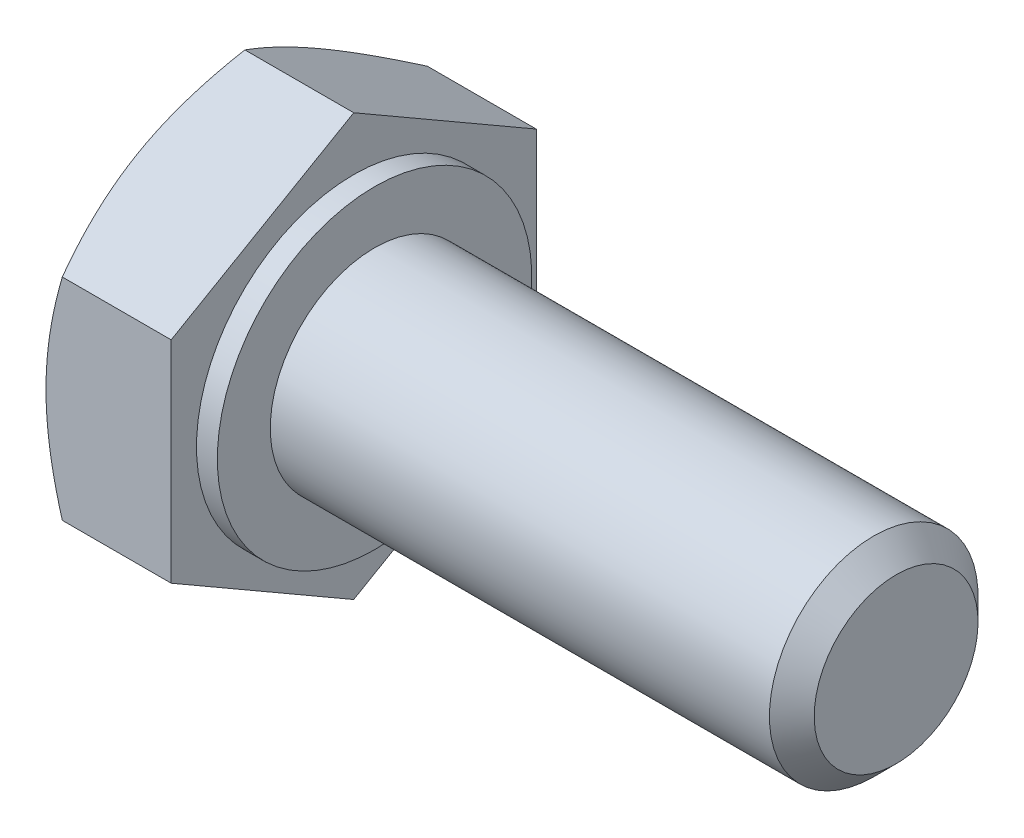
ISO-10303-21;
HEADER;
FILE_DESCRIPTION(('STEP AP214'),'2;1');
FILE_NAME('part.step','',(''),(''),'','','');
FILE_SCHEMA(('AUTOMOTIVE_DESIGN { 1 0 10303 214 1 1 1 1 }'));
ENDSEC;
DATA;
#1=APPLICATION_CONTEXT('core data for automotive mechanical design processes');
#2=APPLICATION_PROTOCOL_DEFINITION('international standard','automotive_design',2000,#1);
#3=PRODUCT_CONTEXT('',#1,'mechanical');
#4=PRODUCT('Part','Part','',(#3));
#5=PRODUCT_RELATED_PRODUCT_CATEGORY('part','',(#4));
#6=PRODUCT_DEFINITION_FORMATION('','',#4);
#7=PRODUCT_DEFINITION_CONTEXT('part definition',#1,'design');
#8=PRODUCT_DEFINITION('design','',#6,#7);
#9=PRODUCT_DEFINITION_SHAPE('','',#8);
#10=(LENGTH_UNIT() NAMED_UNIT(*) SI_UNIT(.MILLI.,.METRE.));
#11=(NAMED_UNIT(*) PLANE_ANGLE_UNIT() SI_UNIT($,.RADIAN.));
#12=(NAMED_UNIT(*) SI_UNIT($,.STERADIAN.) SOLID_ANGLE_UNIT());
#13=UNCERTAINTY_MEASURE_WITH_UNIT(LENGTH_MEASURE(1.E-05),#10,'distance_accuracy_value','');
#14=(GEOMETRIC_REPRESENTATION_CONTEXT(3) GLOBAL_UNCERTAINTY_ASSIGNED_CONTEXT((#13)) GLOBAL_UNIT_ASSIGNED_CONTEXT((#10,
#11,#12)) REPRESENTATION_CONTEXT('',''));
#15=CARTESIAN_POINT('',(0.,0.,0.));
#16=DIRECTION('',(0.,0.,1.));
#17=DIRECTION('',(1.,0.,0.));
#18=AXIS2_PLACEMENT_3D('',#15,#16,#17);
#19=CARTESIAN_POINT('',(0.,2.5075,0.));
#20=DIRECTION('',(1.,0.,0.));
#21=DIRECTION('',(0.,1.,0.));
#22=AXIS2_PLACEMENT_3D('',#19,#20,#21);
#23=PLANE('',#22);
#24=CARTESIAN_POINT('',(0.,0.,0.));
#25=DIRECTION('',(1.,0.,0.));
#26=DIRECTION('',(0.,1.,0.));
#27=AXIS2_PLACEMENT_3D('',#24,#25,#26);
#28=CIRCLE('',#27,2.);
#29=CARTESIAN_POINT('',(0.,-2.,0.));
#30=VERTEX_POINT('',#29);
#31=EDGE_CURVE('E145',#30,#30,#28,.T.);
#32=ORIENTED_EDGE('',*,*,#31,.F.);
#33=EDGE_LOOP('',(#32));
#34=FACE_BOUND('',#33,.T.);
#35=CARTESIAN_POINT('',(0.,0.,0.));
#36=DIRECTION('',(1.,0.,0.));
#37=DIRECTION('',(0.,1.,0.));
#38=AXIS2_PLACEMENT_3D('',#35,#36,#37);
#39=CIRCLE('',#38,3.015);
#40=CARTESIAN_POINT('',(0.,-3.015,0.));
#41=VERTEX_POINT('',#40);
#42=EDGE_CURVE('E30',#41,#41,#39,.T.);
#43=ORIENTED_EDGE('',*,*,#42,.T.);
#44=EDGE_LOOP('',(#43));
#45=FACE_BOUND('',#44,.T.);
#46=ADVANCED_FACE('F17',(#34,#45),#23,.T.);
#47=CARTESIAN_POINT('',(-0.200049999999994,0.,0.));
#48=DIRECTION('',(1.,0.,0.));
#49=DIRECTION('',(0.,1.,0.));
#50=AXIS2_PLACEMENT_3D('',#47,#48,#49);
#51=CYLINDRICAL_SURFACE('',#50,3.015);
#52=ORIENTED_EDGE('',*,*,#42,.F.);
#53=DIRECTION('',(-1.,0.,0.));
#54=VECTOR('',#53,1.);
#55=CARTESIAN_POINT('',(-0.200049999999994,-3.015,0.));
#56=LINE('',#55,#54);
#57=CARTESIAN_POINT('',(-0.400099999999995,-3.015,0.));
#58=VERTEX_POINT('',#57);
#59=EDGE_CURVE('E11',#41,#58,#56,.T.);
#60=ORIENTED_EDGE('',*,*,#59,.T.);
#61=CARTESIAN_POINT('',(-0.400099999999994,0.,0.));
#62=DIRECTION('',(1.,0.,0.));
#63=DIRECTION('',(0.,1.,0.));
#64=AXIS2_PLACEMENT_3D('',#61,#62,#63);
#65=CIRCLE('',#64,3.015);
#66=EDGE_CURVE('E171',#58,#58,#65,.T.);
#67=ORIENTED_EDGE('',*,*,#66,.T.);
#68=ORIENTED_EDGE('',*,*,#59,.F.);
#69=EDGE_LOOP('',(#52,#60,#67,#68));
#70=FACE_BOUND('',#69,.T.);
#71=ADVANCED_FACE('F19',(#70),#51,.T.);
#72=CARTESIAN_POINT('',(-2.8001,0.,0.));
#73=DIRECTION('',(1.,0.,0.));
#74=DIRECTION('',(0.,1.,0.));
#75=AXIS2_PLACEMENT_3D('',#72,#73,#74);
#76=PLANE('',#75);
#77=CARTESIAN_POINT('',(-2.8001,0.,0.));
#78=DIRECTION('',(-1.,0.,0.));
#79=DIRECTION('',(0.,1.,0.));
#80=AXIS2_PLACEMENT_3D('',#77,#78,#79);
#81=CIRCLE('',#80,3.5);
#82=CARTESIAN_POINT('',(-2.8001,0.,3.5));
#83=VERTEX_POINT('',#82);
#84=CARTESIAN_POINT('',(-2.8001,3.03108891324553,1.75));
#85=VERTEX_POINT('',#84);
#86=EDGE_CURVE('E160',#83,#85,#81,.T.);
#87=ORIENTED_EDGE('',*,*,#86,.T.);
#88=CARTESIAN_POINT('',(-2.8001,0.,0.));
#89=DIRECTION('',(-1.,0.,0.));
#90=DIRECTION('',(0.,1.,0.));
#91=AXIS2_PLACEMENT_3D('',#88,#89,#90);
#92=CIRCLE('',#91,3.5);
#93=CARTESIAN_POINT('',(-2.8001,3.03108891324553,-1.75));
#94=VERTEX_POINT('',#93);
#95=EDGE_CURVE('E205',#85,#94,#92,.T.);
#96=ORIENTED_EDGE('',*,*,#95,.T.);
#97=CARTESIAN_POINT('',(-2.8001,0.,0.));
#98=DIRECTION('',(-1.,0.,0.));
#99=DIRECTION('',(0.,1.,0.));
#100=AXIS2_PLACEMENT_3D('',#97,#98,#99);
#101=CIRCLE('',#100,3.5);
#102=CARTESIAN_POINT('',(-2.8001,0.,-3.5));
#103=VERTEX_POINT('',#102);
#104=EDGE_CURVE('E172',#94,#103,#101,.T.);
#105=ORIENTED_EDGE('',*,*,#104,.T.);
#106=CARTESIAN_POINT('',(-2.8001,0.,0.));
#107=DIRECTION('',(-1.,0.,0.));
#108=DIRECTION('',(0.,1.,0.));
#109=AXIS2_PLACEMENT_3D('',#106,#107,#108);
#110=CIRCLE('',#109,3.5);
#111=CARTESIAN_POINT('',(-2.8001,-3.03108891324553,-1.75));
#112=VERTEX_POINT('',#111);
#113=EDGE_CURVE('E282',#103,#112,#110,.T.);
#114=ORIENTED_EDGE('',*,*,#113,.T.);
#115=CARTESIAN_POINT('',(-2.8001,0.,0.));
#116=DIRECTION('',(-1.,0.,0.));
#117=DIRECTION('',(0.,1.,0.));
#118=AXIS2_PLACEMENT_3D('',#115,#116,#117);
#119=CIRCLE('',#118,3.5);
#120=CARTESIAN_POINT('',(-2.8001,-3.03108891324553,1.75));
#121=VERTEX_POINT('',#120);
#122=EDGE_CURVE('E231',#112,#121,#119,.T.);
#123=ORIENTED_EDGE('',*,*,#122,.T.);
#124=CARTESIAN_POINT('',(-2.8001,0.,0.));
#125=DIRECTION('',(-1.,0.,0.));
#126=DIRECTION('',(0.,1.,0.));
#127=AXIS2_PLACEMENT_3D('',#124,#125,#126);
#128=CIRCLE('',#127,3.5);
#129=EDGE_CURVE('E258',#121,#83,#128,.T.);
#130=ORIENTED_EDGE('',*,*,#129,.T.);
#131=EDGE_LOOP('',(#87,#96,#105,#114,#123,#130));
#132=FACE_BOUND('',#131,.T.);
#133=ADVANCED_FACE('F341',(#132),#76,.F.);
#134=CARTESIAN_POINT('',(-0.400099999999993,-4.04145188432738,0.));
#135=DIRECTION('',(0.,-0.866025403784439,-0.5));
#136=DIRECTION('',(0.,0.5,-0.866025403784439));
#137=AXIS2_PLACEMENT_3D('',#134,#135,#136);
#138=PLANE('',#137);
#139=CARTESIAN_POINT('',(-2.8001,-3.03108891324553,-1.75));
#140=CARTESIAN_POINT('',(-2.80010000000001,-2.56217782649107,-2.56217782649106));
#141=CARTESIAN_POINT('',(-2.48749260883037,-2.0207259421637,-3.5));
#142=(BOUNDED_CURVE() B_SPLINE_CURVE(2,(#139,#140,#141),.UNSPECIFIED.,.F.,
.F.) B_SPLINE_CURVE_WITH_KNOTS((3,3),(0.204998401571332,0.409996803142664),
.UNSPECIFIED.) CURVE() GEOMETRIC_REPRESENTATION_ITEM() RATIONAL_B_SPLINE_CURVE((1.,
1.03795484930204,1.)) REPRESENTATION_ITEM(''));
#143=CARTESIAN_POINT('',(-2.48749260883038,-2.0207259421637,-3.5));
#144=VERTEX_POINT('',#143);
#145=EDGE_CURVE('E183',#112,#144,#142,.T.);
#146=ORIENTED_EDGE('',*,*,#145,.T.);
#147=DIRECTION('',(-1.,0.,0.));
#148=VECTOR('',#147,1.);
#149=CARTESIAN_POINT('',(-0.400099999999993,-2.02072594216369,-3.5));
#150=LINE('',#149,#148);
#151=CARTESIAN_POINT('',(-0.400099999999993,-2.02072594216369,-3.5));
#152=VERTEX_POINT('',#151);
#153=EDGE_CURVE('E120',#152,#144,#150,.T.);
#154=ORIENTED_EDGE('',*,*,#153,.F.);
#155=DIRECTION('',(0.,0.5,-0.866025403784439));
#156=VECTOR('',#155,1.);
#157=CARTESIAN_POINT('',(-0.400099999999993,-4.04145188432738,0.));
#158=LINE('',#157,#156);
#159=CARTESIAN_POINT('',(-0.400099999999993,-4.04145188432738,0.));
#160=VERTEX_POINT('',#159);
#161=EDGE_CURVE('E255',#160,#152,#158,.T.);
#162=ORIENTED_EDGE('',*,*,#161,.F.);
#163=DIRECTION('',(-1.,0.,0.));
#164=VECTOR('',#163,1.);
#165=CARTESIAN_POINT('',(-0.400099999999993,-4.04145188432738,0.));
#166=LINE('',#165,#164);
#167=CARTESIAN_POINT('',(-2.48749260883038,-4.04145188432736,0.));
#168=VERTEX_POINT('',#167);
#169=EDGE_CURVE('E170',#160,#168,#166,.T.);
#170=ORIENTED_EDGE('',*,*,#169,.T.);
#171=CARTESIAN_POINT('',(-2.48749260883038,-4.04145188432736,0.));
#172=CARTESIAN_POINT('',(-2.80010000000001,-3.49999999999999,-0.937822173508944));
#173=CARTESIAN_POINT('',(-2.8001,-3.03108891324553,-1.75));
#174=(BOUNDED_CURVE() B_SPLINE_CURVE(2,(#171,#172,#173),.UNSPECIFIED.,.F.,
.F.) B_SPLINE_CURVE_WITH_KNOTS((3,3),(0.,0.204998401571332),
.UNSPECIFIED.) CURVE() GEOMETRIC_REPRESENTATION_ITEM() RATIONAL_B_SPLINE_CURVE((1.,
1.03795484930205,1.)) REPRESENTATION_ITEM(''));
#175=EDGE_CURVE('E204',#168,#112,#174,.T.);
#176=ORIENTED_EDGE('',*,*,#175,.T.);
#177=EDGE_LOOP('',(#146,#154,#162,#170,#176));
#178=FACE_BOUND('',#177,.T.);
#179=ADVANCED_FACE('F330',(#178),#138,.T.);
#180=CARTESIAN_POINT('',(-0.400099999999993,-2.02072594216369,3.5));
#181=DIRECTION('',(0.,-0.866025403784439,0.5));
#182=DIRECTION('',(-1.,0.,0.));
#183=AXIS2_PLACEMENT_3D('',#180,#181,#182);
#184=PLANE('',#183);
#185=CARTESIAN_POINT('',(-2.8001,-3.03108891324553,1.75));
#186=CARTESIAN_POINT('',(-2.80010000000001,-3.49999999999999,0.937822173508936));
#187=CARTESIAN_POINT('',(-2.48749260883038,-4.04145188432736,0.));
#188=(BOUNDED_CURVE() B_SPLINE_CURVE(2,(#185,#186,#187),.UNSPECIFIED.,.F.,
.F.) B_SPLINE_CURVE_WITH_KNOTS((3,3),(0.204998401571332,0.409996803142664),
.UNSPECIFIED.) CURVE() GEOMETRIC_REPRESENTATION_ITEM() RATIONAL_B_SPLINE_CURVE((1.,
1.03795484930205,1.)) REPRESENTATION_ITEM(''));
#189=EDGE_CURVE('E225',#121,#168,#188,.T.);
#190=ORIENTED_EDGE('',*,*,#189,.T.);
#191=ORIENTED_EDGE('',*,*,#169,.F.);
#192=DIRECTION('',(0.,-0.5,-0.866025403784439));
#193=VECTOR('',#192,1.);
#194=CARTESIAN_POINT('',(-0.400099999999993,-2.02072594216369,3.5));
#195=LINE('',#194,#193);
#196=CARTESIAN_POINT('',(-0.400099999999993,-2.02072594216369,3.5));
#197=VERTEX_POINT('',#196);
#198=EDGE_CURVE('E294',#197,#160,#195,.T.);
#199=ORIENTED_EDGE('',*,*,#198,.F.);
#200=DIRECTION('',(-1.,0.,0.));
#201=VECTOR('',#200,1.);
#202=CARTESIAN_POINT('',(-0.400099999999993,-2.02072594216369,3.5));
#203=LINE('',#202,#201);
#204=CARTESIAN_POINT('',(-2.48749260883038,-2.02072594216366,3.5));
#205=VERTEX_POINT('',#204);
#206=EDGE_CURVE('E167',#197,#205,#203,.T.);
#207=ORIENTED_EDGE('',*,*,#206,.T.);
#208=CARTESIAN_POINT('',(-2.48749260883038,-2.02072594216371,3.5));
#209=CARTESIAN_POINT('',(-2.80010000000001,-2.56217782649108,2.56217782649106));
#210=CARTESIAN_POINT('',(-2.8001,-3.03108891324553,1.75));
#211=(BOUNDED_CURVE() B_SPLINE_CURVE(2,(#208,#209,#210),.UNSPECIFIED.,.F.,
.F.) B_SPLINE_CURVE_WITH_KNOTS((3,3),(0.,0.204998401571332),
.UNSPECIFIED.) CURVE() GEOMETRIC_REPRESENTATION_ITEM() RATIONAL_B_SPLINE_CURVE((1.,
1.03795484930205,1.)) REPRESENTATION_ITEM(''));
#212=EDGE_CURVE('E21',#205,#121,#211,.T.);
#213=ORIENTED_EDGE('',*,*,#212,.T.);
#214=EDGE_LOOP('',(#190,#191,#199,#207,#213));
#215=FACE_BOUND('',#214,.T.);
#216=ADVANCED_FACE('F365',(#215),#184,.T.);
#217=CARTESIAN_POINT('',(-0.400099999999994,2.02072594216369,3.5));
#218=DIRECTION('',(0.,0.,1.));
#219=DIRECTION('',(0.,-1.,0.));
#220=AXIS2_PLACEMENT_3D('',#217,#218,#219);
#221=PLANE('',#220);
#222=CARTESIAN_POINT('',(-2.8001,0.,3.5));
#223=CARTESIAN_POINT('',(-2.80010000000001,-0.937822173508923,3.5));
#224=CARTESIAN_POINT('',(-2.48749260883038,-2.02072594216366,3.5));
#225=(BOUNDED_CURVE() B_SPLINE_CURVE(2,(#222,#223,#224),.UNSPECIFIED.,.F.,
.F.) B_SPLINE_CURVE_WITH_KNOTS((3,3),(0.204998401571332,0.409996803142664),
.UNSPECIFIED.) CURVE() GEOMETRIC_REPRESENTATION_ITEM() RATIONAL_B_SPLINE_CURVE((1.,
1.03795484930203,1.)) REPRESENTATION_ITEM(''));
#226=EDGE_CURVE('E261',#83,#205,#225,.T.);
#227=ORIENTED_EDGE('',*,*,#226,.T.);
#228=ORIENTED_EDGE('',*,*,#206,.F.);
#229=DIRECTION('',(0.,-1.,0.));
#230=VECTOR('',#229,1.);
#231=CARTESIAN_POINT('',(-0.400099999999994,2.02072594216369,3.5));
#232=LINE('',#231,#230);
#233=CARTESIAN_POINT('',(-0.400099999999994,2.02072594216369,3.5));
#234=VERTEX_POINT('',#233);
#235=EDGE_CURVE('E242',#234,#197,#232,.T.);
#236=ORIENTED_EDGE('',*,*,#235,.F.);
#237=DIRECTION('',(-1.,0.,0.));
#238=VECTOR('',#237,1.);
#239=CARTESIAN_POINT('',(-0.400099999999994,2.02072594216369,3.5));
#240=LINE('',#239,#238);
#241=CARTESIAN_POINT('',(-2.48749260883038,2.02072594216366,3.5));
#242=VERTEX_POINT('',#241);
#243=EDGE_CURVE('E191',#234,#242,#240,.T.);
#244=ORIENTED_EDGE('',*,*,#243,.T.);
#245=CARTESIAN_POINT('',(-2.48749260883037,2.02072594216366,3.5));
#246=CARTESIAN_POINT('',(-2.80010000000001,0.937822173508917,3.5));
#247=CARTESIAN_POINT('',(-2.8001,0.,3.5));
#248=(BOUNDED_CURVE() B_SPLINE_CURVE(2,(#245,#246,#247),.UNSPECIFIED.,.F.,
.F.) B_SPLINE_CURVE_WITH_KNOTS((3,3),(0.,0.204998401571332),
.UNSPECIFIED.) CURVE() GEOMETRIC_REPRESENTATION_ITEM() RATIONAL_B_SPLINE_CURVE((1.,
1.03795484930204,1.)) REPRESENTATION_ITEM(''));
#249=EDGE_CURVE('E190',#242,#83,#248,.T.);
#250=ORIENTED_EDGE('',*,*,#249,.T.);
#251=EDGE_LOOP('',(#227,#228,#236,#244,#250));
#252=FACE_BOUND('',#251,.T.);
#253=ADVANCED_FACE('F493',(#252),#221,.T.);
#254=CARTESIAN_POINT('',(-0.400099999999993,0.,0.));
#255=DIRECTION('',(1.,0.,0.));
#256=DIRECTION('',(0.,1.,0.));
#257=AXIS2_PLACEMENT_3D('',#254,#255,#256);
#258=PLANE('',#257);
#259=ORIENTED_EDGE('',*,*,#66,.F.);
#260=EDGE_LOOP('',(#259));
#261=FACE_BOUND('',#260,.T.);
#262=DIRECTION('',(0.,-0.5,0.866025403784438));
#263=VECTOR('',#262,1.);
#264=CARTESIAN_POINT('',(-0.400099999999994,4.04145188432738,0.));
#265=LINE('',#264,#263);
#266=CARTESIAN_POINT('',(-0.400099999999994,4.04145188432738,0.));
#267=VERTEX_POINT('',#266);
#268=EDGE_CURVE('E194',#267,#234,#265,.T.);
#269=ORIENTED_EDGE('',*,*,#268,.T.);
#270=ORIENTED_EDGE('',*,*,#235,.T.);
#271=ORIENTED_EDGE('',*,*,#198,.T.);
#272=ORIENTED_EDGE('',*,*,#161,.T.);
#273=DIRECTION('',(0.,1.,0.));
#274=VECTOR('',#273,1.);
#275=CARTESIAN_POINT('',(-0.400099999999993,-2.02072594216369,-3.5));
#276=LINE('',#275,#274);
#277=CARTESIAN_POINT('',(-0.400099999999994,2.02072594216369,-3.5));
#278=VERTEX_POINT('',#277);
#279=EDGE_CURVE('E245',#152,#278,#276,.T.);
#280=ORIENTED_EDGE('',*,*,#279,.T.);
#281=DIRECTION('',(0.,0.5,0.866025403784439));
#282=VECTOR('',#281,1.);
#283=CARTESIAN_POINT('',(-0.400099999999994,2.02072594216369,-3.5));
#284=LINE('',#283,#282);
#285=EDGE_CURVE('E107',#278,#267,#284,.T.);
#286=ORIENTED_EDGE('',*,*,#285,.T.);
#287=EDGE_LOOP('',(#269,#270,#271,#272,#280,#286));
#288=FACE_BOUND('',#287,.T.);
#289=ADVANCED_FACE('F326',(#261,#288),#258,.T.);
#290=CARTESIAN_POINT('',(-0.400099999999994,4.04145188432738,0.));
#291=DIRECTION('',(0.,0.866025403784438,0.5));
#292=DIRECTION('',(1.,0.,0.));
#293=AXIS2_PLACEMENT_3D('',#290,#291,#292);
#294=PLANE('',#293);
#295=CARTESIAN_POINT('',(-2.48749260883038,4.04145188432736,0.));
#296=CARTESIAN_POINT('',(-2.80010000000001,3.49999999999999,0.937822173508938));
#297=CARTESIAN_POINT('',(-2.8001,3.03108891324553,1.75));
#298=(BOUNDED_CURVE() B_SPLINE_CURVE(2,(#295,#296,#297),.UNSPECIFIED.,.F.,
.F.) B_SPLINE_CURVE_WITH_KNOTS((3,3),(0.,0.204998401571332),
.UNSPECIFIED.) CURVE() GEOMETRIC_REPRESENTATION_ITEM() RATIONAL_B_SPLINE_CURVE((1.,
1.03795484930204,1.)) REPRESENTATION_ITEM(''));
#299=CARTESIAN_POINT('',(-2.48749260883038,4.04145188432736,0.));
#300=VERTEX_POINT('',#299);
#301=EDGE_CURVE('E199',#300,#85,#298,.T.);
#302=ORIENTED_EDGE('',*,*,#301,.T.);
#303=CARTESIAN_POINT('',(-2.8001,3.03108891324553,1.75));
#304=CARTESIAN_POINT('',(-2.80010000000001,2.56217782649107,2.56217782649106));
#305=CARTESIAN_POINT('',(-2.48749260883038,2.0207259421637,3.5));
#306=(BOUNDED_CURVE() B_SPLINE_CURVE(2,(#303,#304,#305),.UNSPECIFIED.,.F.,
.F.) B_SPLINE_CURVE_WITH_KNOTS((3,3),(0.204998401571332,0.409996803142664),
.UNSPECIFIED.) CURVE() GEOMETRIC_REPRESENTATION_ITEM() RATIONAL_B_SPLINE_CURVE((1.,
1.03795484930205,1.)) REPRESENTATION_ITEM(''));
#307=EDGE_CURVE('E152',#85,#242,#306,.T.);
#308=ORIENTED_EDGE('',*,*,#307,.T.);
#309=ORIENTED_EDGE('',*,*,#243,.F.);
#310=ORIENTED_EDGE('',*,*,#268,.F.);
#311=DIRECTION('',(-1.,0.,0.));
#312=VECTOR('',#311,1.);
#313=CARTESIAN_POINT('',(-0.400099999999994,4.04145188432738,0.));
#314=LINE('',#313,#312);
#315=EDGE_CURVE('E195',#267,#300,#314,.T.);
#316=ORIENTED_EDGE('',*,*,#315,.T.);
#317=EDGE_LOOP('',(#302,#308,#309,#310,#316));
#318=FACE_BOUND('',#317,.T.);
#319=ADVANCED_FACE('F492',(#318),#294,.T.);
#320=CARTESIAN_POINT('',(-0.400099999999994,2.02072594216369,-3.5));
#321=DIRECTION('',(0.,0.866025403784439,-0.5));
#322=DIRECTION('',(-1.,0.,0.));
#323=AXIS2_PLACEMENT_3D('',#320,#321,#322);
#324=PLANE('',#323);
#325=CARTESIAN_POINT('',(-2.48749260883038,2.0207259421637,-3.5));
#326=CARTESIAN_POINT('',(-2.80010000000001,2.56217782649108,-2.56217782649105));
#327=CARTESIAN_POINT('',(-2.8001,3.03108891324553,-1.75));
#328=(BOUNDED_CURVE() B_SPLINE_CURVE(2,(#325,#326,#327),.UNSPECIFIED.,.F.,
.F.) B_SPLINE_CURVE_WITH_KNOTS((3,3),(0.,0.204998401571332),
.UNSPECIFIED.) CURVE() GEOMETRIC_REPRESENTATION_ITEM() RATIONAL_B_SPLINE_CURVE((1.,
1.03795484930204,1.)) REPRESENTATION_ITEM(''));
#329=CARTESIAN_POINT('',(-2.48749260883038,2.02072594216366,-3.5));
#330=VERTEX_POINT('',#329);
#331=EDGE_CURVE('E176',#330,#94,#328,.T.);
#332=ORIENTED_EDGE('',*,*,#331,.T.);
#333=CARTESIAN_POINT('',(-2.8001,3.03108891324553,-1.75));
#334=CARTESIAN_POINT('',(-2.80010000000001,3.49999999999999,-0.937822173508939));
#335=CARTESIAN_POINT('',(-2.48749260883038,4.04145188432736,0.));
#336=(BOUNDED_CURVE() B_SPLINE_CURVE(2,(#333,#334,#335),.UNSPECIFIED.,.F.,
.F.) B_SPLINE_CURVE_WITH_KNOTS((3,3),(0.204998401571332,0.409996803142665),
.UNSPECIFIED.) CURVE() GEOMETRIC_REPRESENTATION_ITEM() RATIONAL_B_SPLINE_CURVE((1.,
1.03795484930206,1.)) REPRESENTATION_ITEM(''));
#337=EDGE_CURVE('E238',#94,#300,#336,.T.);
#338=ORIENTED_EDGE('',*,*,#337,.T.);
#339=ORIENTED_EDGE('',*,*,#315,.F.);
#340=ORIENTED_EDGE('',*,*,#285,.F.);
#341=DIRECTION('',(-1.,0.,0.));
#342=VECTOR('',#341,1.);
#343=CARTESIAN_POINT('',(-0.400099999999994,2.02072594216369,-3.5));
#344=LINE('',#343,#342);
#345=EDGE_CURVE('E248',#278,#330,#344,.T.);
#346=ORIENTED_EDGE('',*,*,#345,.T.);
#347=EDGE_LOOP('',(#332,#338,#339,#340,#346));
#348=FACE_BOUND('',#347,.T.);
#349=ADVANCED_FACE('F334',(#348),#324,.T.);
#350=CARTESIAN_POINT('',(-0.400099999999993,-2.02072594216369,-3.5));
#351=DIRECTION('',(0.,0.,-1.));
#352=DIRECTION('',(-1.,0.,0.));
#353=AXIS2_PLACEMENT_3D('',#350,#351,#352);
#354=PLANE('',#353);
#355=CARTESIAN_POINT('',(-2.48749260883038,-2.02072594216366,-3.5));
#356=CARTESIAN_POINT('',(-2.80010000000001,-0.937822173508916,-3.5));
#357=CARTESIAN_POINT('',(-2.8001,0.,-3.5));
#358=(BOUNDED_CURVE() B_SPLINE_CURVE(2,(#355,#356,#357),.UNSPECIFIED.,.F.,
.F.) B_SPLINE_CURVE_WITH_KNOTS((3,3),(0.,0.204998401571332),
.UNSPECIFIED.) CURVE() GEOMETRIC_REPRESENTATION_ITEM() RATIONAL_B_SPLINE_CURVE((1.,
1.03795484930204,1.)) REPRESENTATION_ITEM(''));
#359=EDGE_CURVE('E178',#144,#103,#358,.T.);
#360=ORIENTED_EDGE('',*,*,#359,.T.);
#361=CARTESIAN_POINT('',(-2.8001,0.,-3.5));
#362=CARTESIAN_POINT('',(-2.80010000000001,0.937822173508917,-3.5));
#363=CARTESIAN_POINT('',(-2.48749260883038,2.02072594216366,-3.5));
#364=(BOUNDED_CURVE() B_SPLINE_CURVE(2,(#361,#362,#363),.UNSPECIFIED.,.F.,
.F.) B_SPLINE_CURVE_WITH_KNOTS((3,3),(0.204998401571332,0.409996803142664),
.UNSPECIFIED.) CURVE() GEOMETRIC_REPRESENTATION_ITEM() RATIONAL_B_SPLINE_CURVE((1.,
1.03795484930204,1.)) REPRESENTATION_ITEM(''));
#365=EDGE_CURVE('E177',#103,#330,#364,.T.);
#366=ORIENTED_EDGE('',*,*,#365,.T.);
#367=ORIENTED_EDGE('',*,*,#345,.F.);
#368=ORIENTED_EDGE('',*,*,#279,.F.);
#369=ORIENTED_EDGE('',*,*,#153,.T.);
#370=EDGE_LOOP('',(#360,#366,#367,#368,#369));
#371=FACE_BOUND('',#370,.T.);
#372=ADVANCED_FACE('F331',(#371),#354,.T.);
#373=CARTESIAN_POINT('',(-2.64379630441519,0.,0.));
#374=DIRECTION('',(1.,0.,0.));
#375=DIRECTION('',(0.,1.,0.));
#376=AXIS2_PLACEMENT_3D('',#373,#374,#375);
#377=CONICAL_SURFACE('',#376,3.77072594216368,1.0471975511966);
#378=ORIENTED_EDGE('',*,*,#359,.F.);
#379=ORIENTED_EDGE('',*,*,#145,.F.);
#380=ORIENTED_EDGE('',*,*,#113,.F.);
#381=EDGE_LOOP('',(#378,#379,#380));
#382=FACE_BOUND('',#381,.T.);
#383=ADVANCED_FACE('F449',(#382),#377,.T.);
#384=CARTESIAN_POINT('',(-2.64379630441519,0.,0.));
#385=DIRECTION('',(1.,0.,0.));
#386=DIRECTION('',(0.,1.,0.));
#387=AXIS2_PLACEMENT_3D('',#384,#385,#386);
#388=CONICAL_SURFACE('',#387,3.77072594216368,1.0471975511966);
#389=ORIENTED_EDGE('',*,*,#365,.F.);
#390=ORIENTED_EDGE('',*,*,#104,.F.);
#391=ORIENTED_EDGE('',*,*,#331,.F.);
#392=EDGE_LOOP('',(#389,#390,#391));
#393=FACE_BOUND('',#392,.T.);
#394=ADVANCED_FACE('F338',(#393),#388,.T.);
#395=CARTESIAN_POINT('',(-2.64379630441519,0.,0.));
#396=DIRECTION('',(1.,0.,0.));
#397=DIRECTION('',(0.,-1.,0.));
#398=AXIS2_PLACEMENT_3D('',#395,#396,#397);
#399=CONICAL_SURFACE('',#398,3.77072594216368,1.0471975511966);
#400=ORIENTED_EDGE('',*,*,#175,.F.);
#401=ORIENTED_EDGE('',*,*,#189,.F.);
#402=ORIENTED_EDGE('',*,*,#122,.F.);
#403=EDGE_LOOP('',(#400,#401,#402));
#404=FACE_BOUND('',#403,.T.);
#405=ADVANCED_FACE('F370',(#404),#399,.T.);
#406=CARTESIAN_POINT('',(-2.64379630441519,0.,0.));
#407=DIRECTION('',(1.,0.,0.));
#408=DIRECTION('',(0.,1.,0.));
#409=AXIS2_PLACEMENT_3D('',#406,#407,#408);
#410=CONICAL_SURFACE('',#409,3.77072594216368,1.0471975511966);
#411=ORIENTED_EDGE('',*,*,#337,.F.);
#412=ORIENTED_EDGE('',*,*,#95,.F.);
#413=ORIENTED_EDGE('',*,*,#301,.F.);
#414=EDGE_LOOP('',(#411,#412,#413));
#415=FACE_BOUND('',#414,.T.);
#416=ADVANCED_FACE('F346',(#415),#410,.T.);
#417=CARTESIAN_POINT('',(-2.64379630441519,0.,0.));
#418=DIRECTION('',(1.,0.,0.));
#419=DIRECTION('',(0.,1.,0.));
#420=AXIS2_PLACEMENT_3D('',#417,#418,#419);
#421=CONICAL_SURFACE('',#420,3.77072594216368,1.0471975511966);
#422=ORIENTED_EDGE('',*,*,#212,.F.);
#423=ORIENTED_EDGE('',*,*,#226,.F.);
#424=ORIENTED_EDGE('',*,*,#129,.F.);
#425=EDGE_LOOP('',(#422,#423,#424));
#426=FACE_BOUND('',#425,.T.);
#427=ADVANCED_FACE('F512',(#426),#421,.T.);
#428=CARTESIAN_POINT('',(-2.64379630441519,0.,0.));
#429=DIRECTION('',(1.,0.,0.));
#430=DIRECTION('',(0.,1.,0.));
#431=AXIS2_PLACEMENT_3D('',#428,#429,#430);
#432=CONICAL_SURFACE('',#431,3.77072594216368,1.0471975511966);
#433=ORIENTED_EDGE('',*,*,#307,.F.);
#434=ORIENTED_EDGE('',*,*,#86,.F.);
#435=ORIENTED_EDGE('',*,*,#249,.F.);
#436=EDGE_LOOP('',(#433,#434,#435));
#437=FACE_BOUND('',#436,.T.);
#438=ADVANCED_FACE('F503',(#437),#432,.T.);
#439=CARTESIAN_POINT('',(10.,1.,0.));
#440=DIRECTION('',(1.,0.,0.));
#441=DIRECTION('',(0.,1.,0.));
#442=AXIS2_PLACEMENT_3D('',#439,#440,#441);
#443=PLANE('',#442);
#444=CARTESIAN_POINT('',(10.,0.,0.));
#445=DIRECTION('',(-1.,0.,0.));
#446=DIRECTION('',(0.,-1.,0.));
#447=AXIS2_PLACEMENT_3D('',#444,#445,#446);
#448=CIRCLE('',#447,1.570585);
#449=CARTESIAN_POINT('',(10.,1.570585,0.));
#450=VERTEX_POINT('',#449);
#451=EDGE_CURVE('E217',#450,#450,#448,.T.);
#452=ORIENTED_EDGE('',*,*,#451,.F.);
#453=EDGE_LOOP('',(#452));
#454=FACE_BOUND('',#453,.T.);
#455=ADVANCED_FACE('F483',(#454),#443,.T.);
#456=CARTESIAN_POINT('',(6.05,0.,0.));
#457=DIRECTION('',(1.,0.,0.));
#458=DIRECTION('',(0.,1.,0.));
#459=AXIS2_PLACEMENT_3D('',#456,#457,#458);
#460=CYLINDRICAL_SURFACE('',#459,2.);
#461=CARTESIAN_POINT('',(9.570485,0.,0.));
#462=DIRECTION('',(1.,0.,0.));
#463=DIRECTION('',(0.,-1.,0.));
#464=AXIS2_PLACEMENT_3D('',#461,#462,#463);
#465=CIRCLE('',#464,2.);
#466=CARTESIAN_POINT('',(9.570485,2.,0.));
#467=VERTEX_POINT('',#466);
#468=CARTESIAN_POINT('',(9.570485,-2.,0.));
#469=VERTEX_POINT('',#468);
#470=EDGE_CURVE('E206',#467,#469,#465,.T.);
#471=ORIENTED_EDGE('',*,*,#470,.F.);
#472=CARTESIAN_POINT('',(9.570485,0.,0.));
#473=DIRECTION('',(1.,0.,0.));
#474=DIRECTION('',(0.,-1.,0.));
#475=AXIS2_PLACEMENT_3D('',#472,#473,#474);
#476=CIRCLE('',#475,2.);
#477=EDGE_CURVE('E162',#469,#467,#476,.T.);
#478=ORIENTED_EDGE('',*,*,#477,.F.);
#479=DIRECTION('',(-1.,0.,0.));
#480=VECTOR('',#479,1.);
#481=CARTESIAN_POINT('',(6.05,-2.,0.));
#482=LINE('',#481,#480);
#483=EDGE_CURVE('E148',#469,#30,#482,.T.);
#484=ORIENTED_EDGE('',*,*,#483,.T.);
#485=ORIENTED_EDGE('',*,*,#31,.T.);
#486=ORIENTED_EDGE('',*,*,#483,.F.);
#487=EDGE_LOOP('',(#471,#478,#484,#485,#486));
#488=FACE_BOUND('',#487,.T.);
#489=ADVANCED_FACE('F147',(#488),#460,.T.);
#490=CARTESIAN_POINT('',(9.78524250000001,0.,0.));
#491=DIRECTION('',(-1.,0.,0.));
#492=DIRECTION('',(0.,-1.,0.));
#493=AXIS2_PLACEMENT_3D('',#490,#491,#492);
#494=CONICAL_SURFACE('',#493,1.7852925,0.785281739475183);
#495=ORIENTED_EDGE('',*,*,#451,.T.);
#496=DIRECTION('',(-0.707189100539038,0.707024452249557,0.));
#497=VECTOR('',#496,1.);
#498=CARTESIAN_POINT('',(9.78524250000001,1.7852925,0.));
#499=LINE('',#498,#497);
#500=EDGE_CURVE('E213',#450,#467,#499,.T.);
#501=ORIENTED_EDGE('',*,*,#500,.T.);
#502=ORIENTED_EDGE('',*,*,#470,.T.);
#503=ORIENTED_EDGE('',*,*,#477,.T.);
#504=ORIENTED_EDGE('',*,*,#500,.F.);
#505=EDGE_LOOP('',(#495,#501,#502,#503,#504));
#506=FACE_BOUND('',#505,.T.);
#507=ADVANCED_FACE('F455',(#506),#494,.T.);
#508=CLOSED_SHELL('',(#46,#71,#133,#179,#216,#253,#289,#319,#349,#372,#383,#394,#405,#416,#427,
#438,#455,#489,#507));
#509=MANIFOLD_SOLID_BREP('B1',#508);
#510=ADVANCED_BREP_SHAPE_REPRESENTATION('',(#18,#509),#14);
#511=SHAPE_DEFINITION_REPRESENTATION(#9,#510);
ENDSEC;
END-ISO-10303-21;
